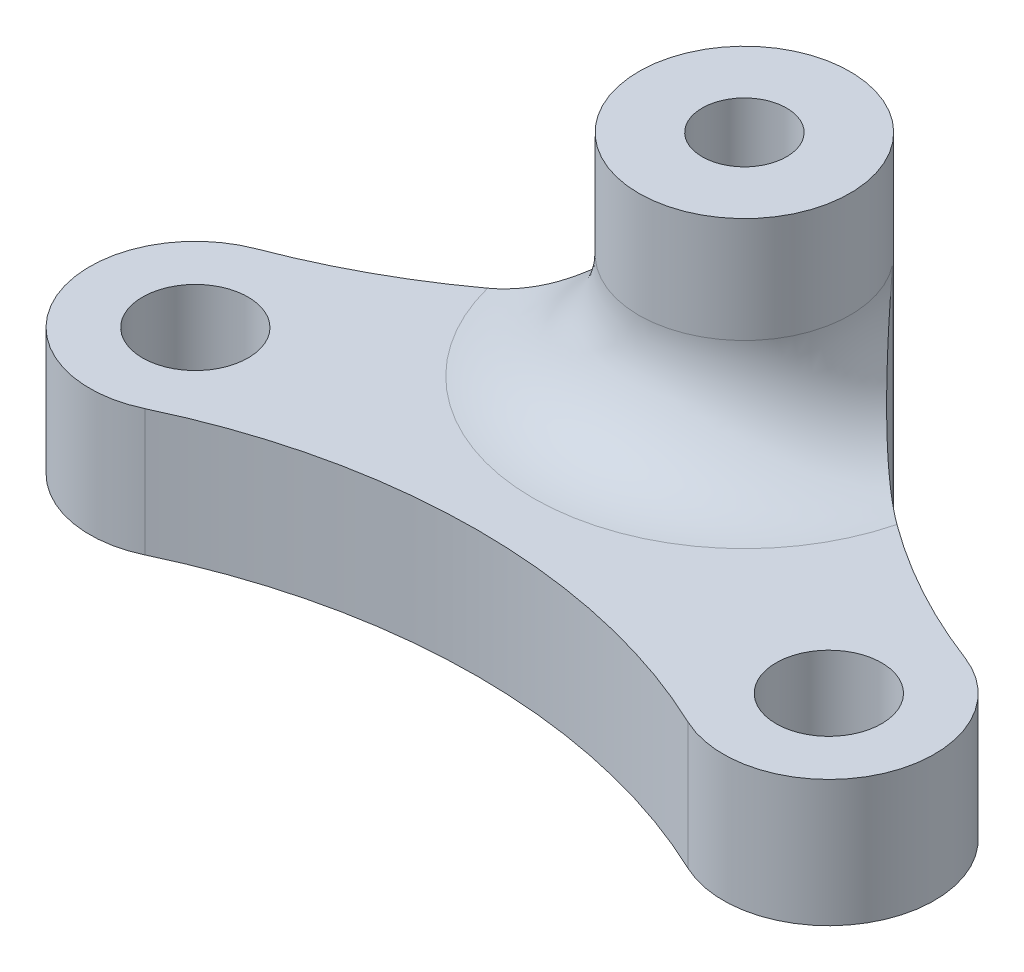
ISO-10303-21;
HEADER;
FILE_DESCRIPTION(('STEP AP214'),'2;1');
FILE_NAME('part.step','',(''),(''),'','','');
FILE_SCHEMA(('AUTOMOTIVE_DESIGN { 1 0 10303 214 1 1 1 1 }'));
ENDSEC;
DATA;
#1=APPLICATION_CONTEXT('core data for automotive mechanical design processes');
#2=APPLICATION_PROTOCOL_DEFINITION('international standard','automotive_design',2000,#1);
#3=PRODUCT_CONTEXT('',#1,'mechanical');
#4=PRODUCT('Part','Part','',(#3));
#5=PRODUCT_RELATED_PRODUCT_CATEGORY('part','',(#4));
#6=PRODUCT_DEFINITION_FORMATION('','',#4);
#7=PRODUCT_DEFINITION_CONTEXT('part definition',#1,'design');
#8=PRODUCT_DEFINITION('design','',#6,#7);
#9=PRODUCT_DEFINITION_SHAPE('','',#8);
#10=(LENGTH_UNIT() NAMED_UNIT(*) SI_UNIT(.MILLI.,.METRE.));
#11=(NAMED_UNIT(*) PLANE_ANGLE_UNIT() SI_UNIT($,.RADIAN.));
#12=(NAMED_UNIT(*) SI_UNIT($,.STERADIAN.) SOLID_ANGLE_UNIT());
#13=UNCERTAINTY_MEASURE_WITH_UNIT(LENGTH_MEASURE(1.E-05),#10,'distance_accuracy_value','');
#14=(GEOMETRIC_REPRESENTATION_CONTEXT(3) GLOBAL_UNCERTAINTY_ASSIGNED_CONTEXT((#13)) GLOBAL_UNIT_ASSIGNED_CONTEXT((#10,
#11,#12)) REPRESENTATION_CONTEXT('',''));
#15=CARTESIAN_POINT('',(0.,0.,0.));
#16=DIRECTION('',(0.,0.,1.));
#17=DIRECTION('',(1.,0.,0.));
#18=AXIS2_PLACEMENT_3D('',#15,#16,#17);
#19=CARTESIAN_POINT('',(0.,6.,42.6227766016838));
#20=DIRECTION('',(0.,-1.,0.));
#21=DIRECTION('',(0.,0.,-1.));
#22=AXIS2_PLACEMENT_3D('',#19,#20,#21);
#23=CYLINDRICAL_SURFACE('',#22,30.);
#24=CARTESIAN_POINT('',(0.,0.,42.6227766016838));
#25=DIRECTION('',(0.,1.,0.));
#26=DIRECTION('',(0.,0.,1.));
#27=AXIS2_PLACEMENT_3D('',#24,#25,#26);
#28=CIRCLE('',#27,30.);
#29=CARTESIAN_POINT('',(-12.8571428571429,0.,15.5175395145263));
#30=VERTEX_POINT('',#29);
#31=CARTESIAN_POINT('',(12.8571428571429,0.,15.5175395145263));
#32=VERTEX_POINT('',#31);
#33=EDGE_CURVE('E116',#30,#32,#28,.F.);
#34=ORIENTED_EDGE('',*,*,#33,.T.);
#35=DIRECTION('',(0.,-1.,0.));
#36=VECTOR('',#35,1.);
#37=CARTESIAN_POINT('',(12.8571428571429,6.,15.5175395145263));
#38=LINE('',#37,#36);
#39=CARTESIAN_POINT('',(12.8571428571429,6.,15.5175395145263));
#40=VERTEX_POINT('',#39);
#41=EDGE_CURVE('E114',#40,#32,#38,.T.);
#42=ORIENTED_EDGE('',*,*,#41,.F.);
#43=CARTESIAN_POINT('',(0.,6.,42.6227766016838));
#44=DIRECTION('',(0.,1.,0.));
#45=DIRECTION('',(0.,0.,1.));
#46=AXIS2_PLACEMENT_3D('',#43,#44,#45);
#47=CIRCLE('',#46,30.);
#48=CARTESIAN_POINT('',(-12.8571428571429,6.,15.5175395145263));
#49=VERTEX_POINT('',#48);
#50=EDGE_CURVE('E100',#49,#40,#47,.F.);
#51=ORIENTED_EDGE('',*,*,#50,.F.);
#52=DIRECTION('',(0.,-1.,0.));
#53=VECTOR('',#52,1.);
#54=CARTESIAN_POINT('',(-12.8571428571429,6.,15.5175395145263));
#55=LINE('',#54,#53);
#56=EDGE_CURVE('E138',#49,#30,#55,.T.);
#57=ORIENTED_EDGE('',*,*,#56,.T.);
#58=EDGE_LOOP('',(#34,#42,#51,#57));
#59=FACE_BOUND('',#58,.T.);
#60=ADVANCED_FACE('F35',(#59),#23,.F.);
#61=CARTESIAN_POINT('',(15.0000000000001,6.,11.));
#62=DIRECTION('',(0.,-1.,0.));
#63=DIRECTION('',(0.,0.,-1.));
#64=AXIS2_PLACEMENT_3D('',#61,#62,#63);
#65=CYLINDRICAL_SURFACE('',#64,5.00000000000001);
#66=CARTESIAN_POINT('',(15.0000000000001,0.,11.));
#67=DIRECTION('',(0.,1.,0.));
#68=DIRECTION('',(0.,0.,1.));
#69=AXIS2_PLACEMENT_3D('',#66,#67,#68);
#70=CIRCLE('',#69,5.00000000000001);
#71=CARTESIAN_POINT('',(16.7790850011928,0.,6.32722175162025));
#72=VERTEX_POINT('',#71);
#73=EDGE_CURVE('E140',#72,#32,#70,.F.);
#74=ORIENTED_EDGE('',*,*,#73,.F.);
#75=DIRECTION('',(0.,-1.,0.));
#76=VECTOR('',#75,1.);
#77=CARTESIAN_POINT('',(16.7790850011928,6.,6.32722175162025));
#78=LINE('',#77,#76);
#79=CARTESIAN_POINT('',(16.7790850011928,6.,6.32722175162025));
#80=VERTEX_POINT('',#79);
#81=EDGE_CURVE('E121',#80,#72,#78,.T.);
#82=ORIENTED_EDGE('',*,*,#81,.F.);
#83=CARTESIAN_POINT('',(15.0000000000001,6.,11.));
#84=DIRECTION('',(0.,1.,0.));
#85=DIRECTION('',(0.,0.,1.));
#86=AXIS2_PLACEMENT_3D('',#83,#84,#85);
#87=CIRCLE('',#86,5.00000000000001);
#88=EDGE_CURVE('E105',#80,#40,#87,.F.);
#89=ORIENTED_EDGE('',*,*,#88,.T.);
#90=ORIENTED_EDGE('',*,*,#41,.T.);
#91=EDGE_LOOP('',(#74,#82,#89,#90));
#92=FACE_BOUND('',#91,.T.);
#93=ADVANCED_FACE('F123',(#92),#65,.T.);
#94=CARTESIAN_POINT('',(27.4535950083494,6.,-21.7094477386582));
#95=DIRECTION('',(0.,-1.,0.));
#96=DIRECTION('',(0.,0.,-1.));
#97=AXIS2_PLACEMENT_3D('',#94,#95,#96);
#98=CYLINDRICAL_SURFACE('',#97,30.);
#99=CARTESIAN_POINT('',(27.4535950083494,0.,-21.7094477386582));
#100=DIRECTION('',(0.,1.,0.));
#101=DIRECTION('',(0.,0.,1.));
#102=AXIS2_PLACEMENT_3D('',#99,#100,#101);
#103=CIRCLE('',#102,30.);
#104=CARTESIAN_POINT('',(3.92194214404991,0.,-3.10134967695118));
#105=VERTEX_POINT('',#104);
#106=EDGE_CURVE('E143',#72,#105,#103,.F.);
#107=ORIENTED_EDGE('',*,*,#106,.T.);
#108=DIRECTION('',(0.,-1.,0.));
#109=VECTOR('',#108,1.);
#110=CARTESIAN_POINT('',(3.92194214404991,6.,-3.10134967695118));
#111=LINE('',#110,#109);
#112=CARTESIAN_POINT('',(3.92194214404991,11.,-3.10134967695118));
#113=VERTEX_POINT('',#112);
#114=EDGE_CURVE('E166',#113,#105,#111,.T.);
#115=ORIENTED_EDGE('',*,*,#114,.F.);
#116=CARTESIAN_POINT('',(9.69097791395203,6.,2.46676854838351));
#117=CARTESIAN_POINT('',(9.6037484844258,5.99999840010719,2.40268158077556));
#118=CARTESIAN_POINT('',(9.51689111835383,6.00302115262935,2.33813722559444));
#119=CARTESIAN_POINT('',(9.34415659762123,6.01491855696297,2.20832589310317));
#120=CARTESIAN_POINT('',(9.25827918775631,6.02379164810867,2.14305911307487));
#121=CARTESIAN_POINT('',(9.00283452835329,6.05883443930501,1.94674448213597));
#122=CARTESIAN_POINT('',(8.83500973446839,6.09342971180285,1.81485511096771));
#123=CARTESIAN_POINT('',(8.50837597719983,6.18245556537318,1.55257878620321));
#124=CARTESIAN_POINT('',(8.34946384220429,6.23654883693585,1.42220303235655));
#125=CARTESIAN_POINT('',(8.0384876246,6.36266500589309,1.16181728450369));
#126=CARTESIAN_POINT('',(7.88642784416319,6.43469898692928,1.03180756703275));
#127=CARTESIAN_POINT('',(7.55807270703794,6.6116964621324,0.745512618746576));
#128=CARTESIAN_POINT('',(7.38352859947038,6.72040663170957,0.589539618961561));
#129=CARTESIAN_POINT('',(7.04559054503209,6.95753170801045,0.280680705046913));
#130=CARTESIAN_POINT('',(6.88219834721414,7.0859496954726,0.127795277804081));
#131=CARTESIAN_POINT('',(6.40635583752156,7.4972407640313,-0.327036579955008));
#132=CARTESIAN_POINT('',(6.1101351230409,7.80505519669731,-0.62348623706119));
#133=CARTESIAN_POINT('',(5.65008147576536,8.34901770790191,-1.10178861481344));
#134=CARTESIAN_POINT('',(5.47583429313437,8.57324942235184,-1.28789002912442));
#135=CARTESIAN_POINT('',(5.13983775010255,9.03458358040658,-1.65556307109389));
#136=CARTESIAN_POINT('',(4.97809189465014,9.27168960203649,-1.83713341880281));
#137=CARTESIAN_POINT('',(4.66451544504919,9.75365491053869,-2.19753228131463));
#138=CARTESIAN_POINT('',(4.51267255419561,9.99850399892136,-2.37636397703886));
#139=CARTESIAN_POINT('',(4.21582450808431,10.4921035881041,-2.73419928621193));
#140=CARTESIAN_POINT('',(4.07081849124306,10.740853592017,-2.91320287508214));
#141=CARTESIAN_POINT('',(3.92591545504175,10.993081674529,-3.096325891144));
#142=CARTESIAN_POINT('',(3.92392859924187,10.9965408380527,-3.09883762656129));
#143=CARTESIAN_POINT('',(3.92194214404991,11.,-3.10134967695118));
#144=B_SPLINE_CURVE_WITH_KNOTS('',3,(#116,#117,#118,#119,#120,#121,#122,#123,#124,#125,#126,
#127,#128,#129,#130,#131,#132,#133,#134,#135,#136,#137,#138,#139,#140,#141,#142,#143),
.UNSPECIFIED.,.F.,.F.,(4,2,2,2,2,2,2,2,2,2,2,2,2,4),(0.,0.324627021980497,0.649167479842402,
1.29659987659227,1.93333086342019,2.57045619809716,3.34351878063213,4.11670233211981,
5.67123640273539,6.68941597406413,7.70787998065886,8.72505426645956,9.74210002335494,
9.75624215906233),.UNSPECIFIED.);
#145=CARTESIAN_POINT('',(9.69097791395203,6.,2.46676854838351));
#146=VERTEX_POINT('',#145);
#147=EDGE_CURVE('E49',#113,#146,#144,.F.);
#148=ORIENTED_EDGE('',*,*,#147,.T.);
#149=CARTESIAN_POINT('',(27.4535950083494,6.,-21.7094477386582));
#150=DIRECTION('',(0.,1.,0.));
#151=DIRECTION('',(0.,0.,1.));
#152=AXIS2_PLACEMENT_3D('',#149,#150,#151);
#153=CIRCLE('',#152,30.);
#154=EDGE_CURVE('E124',#80,#146,#153,.F.);
#155=ORIENTED_EDGE('',*,*,#154,.F.);
#156=ORIENTED_EDGE('',*,*,#81,.T.);
#157=EDGE_LOOP('',(#107,#115,#148,#155,#156));
#158=FACE_BOUND('',#157,.T.);
#159=ADVANCED_FACE('F177',(#158),#98,.F.);
#160=CARTESIAN_POINT('',(0.,6.,0.));
#161=DIRECTION('',(0.,-1.,0.));
#162=DIRECTION('',(0.,0.,-1.));
#163=AXIS2_PLACEMENT_3D('',#160,#161,#162);
#164=CYLINDRICAL_SURFACE('',#163,5.);
#165=CARTESIAN_POINT('',(0.,11.,0.));
#166=DIRECTION('',(0.,1.,0.));
#167=DIRECTION('',(0.,0.,1.));
#168=AXIS2_PLACEMENT_3D('',#165,#166,#167);
#169=CIRCLE('',#168,5.);
#170=CARTESIAN_POINT('',(-3.92194214404991,11.,-3.10134967695118));
#171=VERTEX_POINT('',#170);
#172=EDGE_CURVE('E120',#171,#113,#169,.T.);
#173=ORIENTED_EDGE('',*,*,#172,.T.);
#174=ORIENTED_EDGE('',*,*,#114,.T.);
#175=CARTESIAN_POINT('',(0.,0.,0.));
#176=DIRECTION('',(0.,1.,0.));
#177=DIRECTION('',(0.,0.,1.));
#178=AXIS2_PLACEMENT_3D('',#175,#176,#177);
#179=CIRCLE('',#178,5.);
#180=CARTESIAN_POINT('',(-3.92194214404991,0.,-3.10134967695118));
#181=VERTEX_POINT('',#180);
#182=EDGE_CURVE('E145',#105,#181,#179,.T.);
#183=ORIENTED_EDGE('',*,*,#182,.T.);
#184=DIRECTION('',(0.,-1.,0.));
#185=VECTOR('',#184,1.);
#186=CARTESIAN_POINT('',(-3.92194214404991,6.,-3.10134967695118));
#187=LINE('',#186,#185);
#188=EDGE_CURVE('E164',#171,#181,#187,.T.);
#189=ORIENTED_EDGE('',*,*,#188,.F.);
#190=EDGE_LOOP('',(#173,#174,#183,#189));
#191=FACE_BOUND('',#190,.T.);
#192=CARTESIAN_POINT('',(0.,16.,0.));
#193=DIRECTION('',(0.,1.,0.));
#194=DIRECTION('',(0.,0.,1.));
#195=AXIS2_PLACEMENT_3D('',#192,#193,#194);
#196=CIRCLE('',#195,5.);
#197=CARTESIAN_POINT('',(0.,16.,5.));
#198=VERTEX_POINT('',#197);
#199=EDGE_CURVE('E141',#198,#198,#196,.T.);
#200=ORIENTED_EDGE('',*,*,#199,.F.);
#201=EDGE_LOOP('',(#200));
#202=FACE_BOUND('',#201,.T.);
#203=ADVANCED_FACE('F182',(#191,#202),#164,.T.);
#204=CARTESIAN_POINT('',(-27.4535950083494,6.,-21.7094477386582));
#205=DIRECTION('',(0.,-1.,0.));
#206=DIRECTION('',(0.,0.,-1.));
#207=AXIS2_PLACEMENT_3D('',#204,#205,#206);
#208=CYLINDRICAL_SURFACE('',#207,30.);
#209=CARTESIAN_POINT('',(-27.4535950083494,0.,-21.7094477386582));
#210=DIRECTION('',(0.,1.,0.));
#211=DIRECTION('',(0.,0.,1.));
#212=AXIS2_PLACEMENT_3D('',#209,#210,#211);
#213=CIRCLE('',#212,30.);
#214=CARTESIAN_POINT('',(-16.7790850011928,0.,6.32722175162026));
#215=VERTEX_POINT('',#214);
#216=EDGE_CURVE('E148',#215,#181,#213,.T.);
#217=ORIENTED_EDGE('',*,*,#216,.F.);
#218=DIRECTION('',(0.,-1.,0.));
#219=VECTOR('',#218,1.);
#220=CARTESIAN_POINT('',(-16.7790850011928,6.,6.32722175162026));
#221=LINE('',#220,#219);
#222=CARTESIAN_POINT('',(-16.7790850011928,6.,6.32722175162026));
#223=VERTEX_POINT('',#222);
#224=EDGE_CURVE('E162',#223,#215,#221,.T.);
#225=ORIENTED_EDGE('',*,*,#224,.F.);
#226=CARTESIAN_POINT('',(-27.4535950083494,6.,-21.7094477386582));
#227=DIRECTION('',(0.,1.,0.));
#228=DIRECTION('',(0.,0.,1.));
#229=AXIS2_PLACEMENT_3D('',#226,#227,#228);
#230=CIRCLE('',#229,30.);
#231=CARTESIAN_POINT('',(-9.69097791395203,6.,2.46676854838351));
#232=VERTEX_POINT('',#231);
#233=EDGE_CURVE('E126',#223,#232,#230,.T.);
#234=ORIENTED_EDGE('',*,*,#233,.T.);
#235=CARTESIAN_POINT('',(-9.69097791395203,6.,2.46676854838351));
#236=CARTESIAN_POINT('',(-9.6037484844258,5.99999840010719,2.40268158077556));
#237=CARTESIAN_POINT('',(-9.51689111835383,6.00302115262935,2.33813722559444));
#238=CARTESIAN_POINT('',(-9.34415659762123,6.01491855696297,2.20832589310317));
#239=CARTESIAN_POINT('',(-9.25827918775631,6.02379164810867,2.14305911307487));
#240=CARTESIAN_POINT('',(-9.00283452835329,6.05883443930501,1.94674448213597));
#241=CARTESIAN_POINT('',(-8.83500973446839,6.09342971180285,1.81485511096771));
#242=CARTESIAN_POINT('',(-8.50837597719983,6.18245556537318,1.55257878620321));
#243=CARTESIAN_POINT('',(-8.34946384220429,6.23654883693585,1.42220303235655));
#244=CARTESIAN_POINT('',(-8.0384876246,6.36266500589309,1.16181728450369));
#245=CARTESIAN_POINT('',(-7.88642784416319,6.43469898692928,1.03180756703275));
#246=CARTESIAN_POINT('',(-7.55807270703794,6.6116964621324,0.745512618746576));
#247=CARTESIAN_POINT('',(-7.38352859947038,6.72040663170957,0.589539618961561));
#248=CARTESIAN_POINT('',(-7.04559054503209,6.95753170801045,0.280680705046913));
#249=CARTESIAN_POINT('',(-6.88219834721414,7.0859496954726,0.127795277804081));
#250=CARTESIAN_POINT('',(-6.40635583752156,7.4972407640313,-0.327036579955008));
#251=CARTESIAN_POINT('',(-6.1101351230409,7.80505519669731,-0.62348623706119));
#252=CARTESIAN_POINT('',(-5.65008147576536,8.34901770790191,-1.10178861481344));
#253=CARTESIAN_POINT('',(-5.47583429313437,8.57324942235184,-1.28789002912442));
#254=CARTESIAN_POINT('',(-5.13983775010255,9.03458358040658,-1.65556307109389));
#255=CARTESIAN_POINT('',(-4.97809189465014,9.27168960203649,-1.83713341880281));
#256=CARTESIAN_POINT('',(-4.66451544504919,9.75365491053869,-2.19753228131463));
#257=CARTESIAN_POINT('',(-4.51267255419561,9.99850399892136,-2.37636397703886));
#258=CARTESIAN_POINT('',(-4.21582450808431,10.4921035881041,-2.73419928621193));
#259=CARTESIAN_POINT('',(-4.07081849124306,10.740853592017,-2.91320287508214));
#260=CARTESIAN_POINT('',(-3.92591545504175,10.993081674529,-3.096325891144));
#261=CARTESIAN_POINT('',(-3.92392859924187,10.9965408380527,-3.09883762656129));
#262=CARTESIAN_POINT('',(-3.92194214404991,11.,-3.10134967695118));
#263=B_SPLINE_CURVE_WITH_KNOTS('',3,(#235,#236,#237,#238,#239,#240,#241,#242,#243,#244,#245,
#246,#247,#248,#249,#250,#251,#252,#253,#254,#255,#256,#257,#258,#259,#260,#261,#262),
.UNSPECIFIED.,.F.,.F.,(4,2,2,2,2,2,2,2,2,2,2,2,2,4),(0.,0.324627021980497,0.649167479842402,
1.29659987659227,1.93333086342019,2.57045619809716,3.34351878063213,4.11670233211981,
5.67123640273539,6.68941597406413,7.70787998065886,8.72505426645956,9.74210002335494,
9.75624215906233),.UNSPECIFIED.);
#264=EDGE_CURVE('E11',#232,#171,#263,.T.);
#265=ORIENTED_EDGE('',*,*,#264,.T.);
#266=ORIENTED_EDGE('',*,*,#188,.T.);
#267=EDGE_LOOP('',(#217,#225,#234,#265,#266));
#268=FACE_BOUND('',#267,.T.);
#269=ADVANCED_FACE('F203',(#268),#208,.F.);
#270=CARTESIAN_POINT('',(0.,6.,0.));
#271=DIRECTION('',(0.,-1.,0.));
#272=DIRECTION('',(0.,0.,-1.));
#273=AXIS2_PLACEMENT_3D('',#270,#271,#272);
#274=CYLINDRICAL_SURFACE('',#273,2.);
#275=CARTESIAN_POINT('',(0.,0.,0.));
#276=DIRECTION('',(0.,1.,0.));
#277=DIRECTION('',(0.,0.,1.));
#278=AXIS2_PLACEMENT_3D('',#275,#276,#277);
#279=CIRCLE('',#278,2.);
#280=CARTESIAN_POINT('',(0.,0.,2.));
#281=VERTEX_POINT('',#280);
#282=EDGE_CURVE('E156',#281,#281,#279,.T.);
#283=ORIENTED_EDGE('',*,*,#282,.F.);
#284=EDGE_LOOP('',(#283));
#285=FACE_BOUND('',#284,.T.);
#286=CARTESIAN_POINT('',(0.,16.,0.));
#287=DIRECTION('',(0.,1.,0.));
#288=DIRECTION('',(0.,0.,1.));
#289=AXIS2_PLACEMENT_3D('',#286,#287,#288);
#290=CIRCLE('',#289,2.);
#291=CARTESIAN_POINT('',(0.,16.,2.));
#292=VERTEX_POINT('',#291);
#293=EDGE_CURVE('E330',#292,#292,#290,.T.);
#294=ORIENTED_EDGE('',*,*,#293,.T.);
#295=EDGE_LOOP('',(#294));
#296=FACE_BOUND('',#295,.T.);
#297=ADVANCED_FACE('F210',(#285,#296),#274,.F.);
#298=CARTESIAN_POINT('',(-15.,6.,11.));
#299=DIRECTION('',(0.,-1.,0.));
#300=DIRECTION('',(0.,0.,-1.));
#301=AXIS2_PLACEMENT_3D('',#298,#299,#300);
#302=CYLINDRICAL_SURFACE('',#301,2.5);
#303=CARTESIAN_POINT('',(-15.,6.,11.));
#304=DIRECTION('',(0.,1.,0.));
#305=DIRECTION('',(0.,0.,1.));
#306=AXIS2_PLACEMENT_3D('',#303,#304,#305);
#307=CIRCLE('',#306,2.5);
#308=CARTESIAN_POINT('',(-15.,6.,13.5));
#309=VERTEX_POINT('',#308);
#310=EDGE_CURVE('E132',#309,#309,#307,.T.);
#311=ORIENTED_EDGE('',*,*,#310,.T.);
#312=EDGE_LOOP('',(#311));
#313=FACE_BOUND('',#312,.T.);
#314=CARTESIAN_POINT('',(-15.,0.,11.));
#315=DIRECTION('',(0.,1.,0.));
#316=DIRECTION('',(0.,0.,1.));
#317=AXIS2_PLACEMENT_3D('',#314,#315,#316);
#318=CIRCLE('',#317,2.5);
#319=CARTESIAN_POINT('',(-15.,0.,13.5));
#320=VERTEX_POINT('',#319);
#321=EDGE_CURVE('E153',#320,#320,#318,.T.);
#322=ORIENTED_EDGE('',*,*,#321,.F.);
#323=EDGE_LOOP('',(#322));
#324=FACE_BOUND('',#323,.T.);
#325=ADVANCED_FACE('F218',(#313,#324),#302,.F.);
#326=CARTESIAN_POINT('',(-15.,6.,11.));
#327=DIRECTION('',(0.,-1.,0.));
#328=DIRECTION('',(0.,0.,-1.));
#329=AXIS2_PLACEMENT_3D('',#326,#327,#328);
#330=CYLINDRICAL_SURFACE('',#329,5.);
#331=CARTESIAN_POINT('',(-15.,0.,11.));
#332=DIRECTION('',(0.,1.,0.));
#333=DIRECTION('',(0.,0.,1.));
#334=AXIS2_PLACEMENT_3D('',#331,#332,#333);
#335=CIRCLE('',#334,5.);
#336=EDGE_CURVE('E151',#215,#30,#335,.T.);
#337=ORIENTED_EDGE('',*,*,#336,.T.);
#338=ORIENTED_EDGE('',*,*,#56,.F.);
#339=CARTESIAN_POINT('',(-15.,6.,11.));
#340=DIRECTION('',(0.,1.,0.));
#341=DIRECTION('',(0.,0.,1.));
#342=AXIS2_PLACEMENT_3D('',#339,#340,#341);
#343=CIRCLE('',#342,5.);
#344=EDGE_CURVE('E107',#223,#49,#343,.T.);
#345=ORIENTED_EDGE('',*,*,#344,.F.);
#346=ORIENTED_EDGE('',*,*,#224,.T.);
#347=EDGE_LOOP('',(#337,#338,#345,#346));
#348=FACE_BOUND('',#347,.T.);
#349=ADVANCED_FACE('F226',(#348),#330,.T.);
#350=CARTESIAN_POINT('',(15.0000000000001,6.,11.));
#351=DIRECTION('',(0.,-1.,0.));
#352=DIRECTION('',(0.,0.,-1.));
#353=AXIS2_PLACEMENT_3D('',#350,#351,#352);
#354=CYLINDRICAL_SURFACE('',#353,2.5);
#355=CARTESIAN_POINT('',(15.0000000000001,6.,11.));
#356=DIRECTION('',(0.,1.,0.));
#357=DIRECTION('',(0.,0.,1.));
#358=AXIS2_PLACEMENT_3D('',#355,#356,#357);
#359=CIRCLE('',#358,2.5);
#360=CARTESIAN_POINT('',(15.0000000000001,6.,13.5));
#361=VERTEX_POINT('',#360);
#362=EDGE_CURVE('E135',#361,#361,#359,.F.);
#363=ORIENTED_EDGE('',*,*,#362,.F.);
#364=EDGE_LOOP('',(#363));
#365=FACE_BOUND('',#364,.T.);
#366=CARTESIAN_POINT('',(15.0000000000001,0.,11.));
#367=DIRECTION('',(0.,1.,0.));
#368=DIRECTION('',(0.,0.,1.));
#369=AXIS2_PLACEMENT_3D('',#366,#367,#368);
#370=CIRCLE('',#369,2.5);
#371=CARTESIAN_POINT('',(15.0000000000001,0.,13.5));
#372=VERTEX_POINT('',#371);
#373=EDGE_CURVE('E111',#372,#372,#370,.F.);
#374=ORIENTED_EDGE('',*,*,#373,.T.);
#375=EDGE_LOOP('',(#374));
#376=FACE_BOUND('',#375,.T.);
#377=ADVANCED_FACE('F234',(#365,#376),#354,.F.);
#378=CARTESIAN_POINT('',(0.,6.,0.));
#379=DIRECTION('',(0.,1.,0.));
#380=DIRECTION('',(0.,0.,1.));
#381=AXIS2_PLACEMENT_3D('',#378,#379,#380);
#382=PLANE('',#381);
#383=ORIENTED_EDGE('',*,*,#154,.T.);
#384=CARTESIAN_POINT('',(0.,6.,0.));
#385=DIRECTION('',(0.,1.,0.));
#386=DIRECTION('',(0.,0.,1.));
#387=AXIS2_PLACEMENT_3D('',#384,#385,#386);
#388=CIRCLE('',#387,10.);
#389=EDGE_CURVE('E62',#146,#232,#388,.F.);
#390=ORIENTED_EDGE('',*,*,#389,.T.);
#391=ORIENTED_EDGE('',*,*,#233,.F.);
#392=ORIENTED_EDGE('',*,*,#344,.T.);
#393=ORIENTED_EDGE('',*,*,#50,.T.);
#394=ORIENTED_EDGE('',*,*,#88,.F.);
#395=EDGE_LOOP('',(#383,#390,#391,#392,#393,#394));
#396=FACE_BOUND('',#395,.T.);
#397=ORIENTED_EDGE('',*,*,#310,.F.);
#398=EDGE_LOOP('',(#397));
#399=FACE_BOUND('',#398,.T.);
#400=ORIENTED_EDGE('',*,*,#362,.T.);
#401=EDGE_LOOP('',(#400));
#402=FACE_BOUND('',#401,.T.);
#403=ADVANCED_FACE('F102',(#396,#399,#402),#382,.T.);
#404=CARTESIAN_POINT('',(0.,0.,0.));
#405=DIRECTION('',(0.,1.,0.));
#406=DIRECTION('',(0.,0.,1.));
#407=AXIS2_PLACEMENT_3D('',#404,#405,#406);
#408=PLANE('',#407);
#409=ORIENTED_EDGE('',*,*,#33,.F.);
#410=ORIENTED_EDGE('',*,*,#336,.F.);
#411=ORIENTED_EDGE('',*,*,#216,.T.);
#412=ORIENTED_EDGE('',*,*,#182,.F.);
#413=ORIENTED_EDGE('',*,*,#106,.F.);
#414=ORIENTED_EDGE('',*,*,#73,.T.);
#415=EDGE_LOOP('',(#409,#410,#411,#412,#413,#414));
#416=FACE_BOUND('',#415,.T.);
#417=ORIENTED_EDGE('',*,*,#321,.T.);
#418=EDGE_LOOP('',(#417));
#419=FACE_BOUND('',#418,.T.);
#420=ORIENTED_EDGE('',*,*,#282,.T.);
#421=EDGE_LOOP('',(#420));
#422=FACE_BOUND('',#421,.T.);
#423=ORIENTED_EDGE('',*,*,#373,.F.);
#424=EDGE_LOOP('',(#423));
#425=FACE_BOUND('',#424,.T.);
#426=ADVANCED_FACE('F248',(#416,#419,#422,#425),#408,.F.);
#427=CARTESIAN_POINT('',(0.,16.,0.));
#428=DIRECTION('',(0.,1.,0.));
#429=DIRECTION('',(0.,0.,1.));
#430=AXIS2_PLACEMENT_3D('',#427,#428,#429);
#431=PLANE('',#430);
#432=ORIENTED_EDGE('',*,*,#199,.T.);
#433=EDGE_LOOP('',(#432));
#434=FACE_BOUND('',#433,.T.);
#435=ORIENTED_EDGE('',*,*,#293,.F.);
#436=EDGE_LOOP('',(#435));
#437=FACE_BOUND('',#436,.T.);
#438=ADVANCED_FACE('F255',(#434,#437),#431,.T.);
#439=CARTESIAN_POINT('',(0.,11.,0.));
#440=DIRECTION('',(0.,1.,0.));
#441=DIRECTION('',(0.,0.,1.));
#442=AXIS2_PLACEMENT_3D('',#439,#440,#441);
#443=TOROIDAL_SURFACE('',#442,10.,5.);
#444=ORIENTED_EDGE('',*,*,#264,.F.);
#445=ORIENTED_EDGE('',*,*,#389,.F.);
#446=ORIENTED_EDGE('',*,*,#147,.F.);
#447=ORIENTED_EDGE('',*,*,#172,.F.);
#448=EDGE_LOOP('',(#444,#445,#446,#447));
#449=FACE_BOUND('',#448,.T.);
#450=ADVANCED_FACE('F37',(#449),#443,.F.);
#451=CLOSED_SHELL('',(#60,#93,#159,#203,#269,#297,#325,#349,#377,#403,#426,#438,#450));
#452=MANIFOLD_SOLID_BREP('B2',#451);
#453=ADVANCED_BREP_SHAPE_REPRESENTATION('',(#18,#452),#14);
#454=SHAPE_DEFINITION_REPRESENTATION(#9,#453);
ENDSEC;
END-ISO-10303-21;
